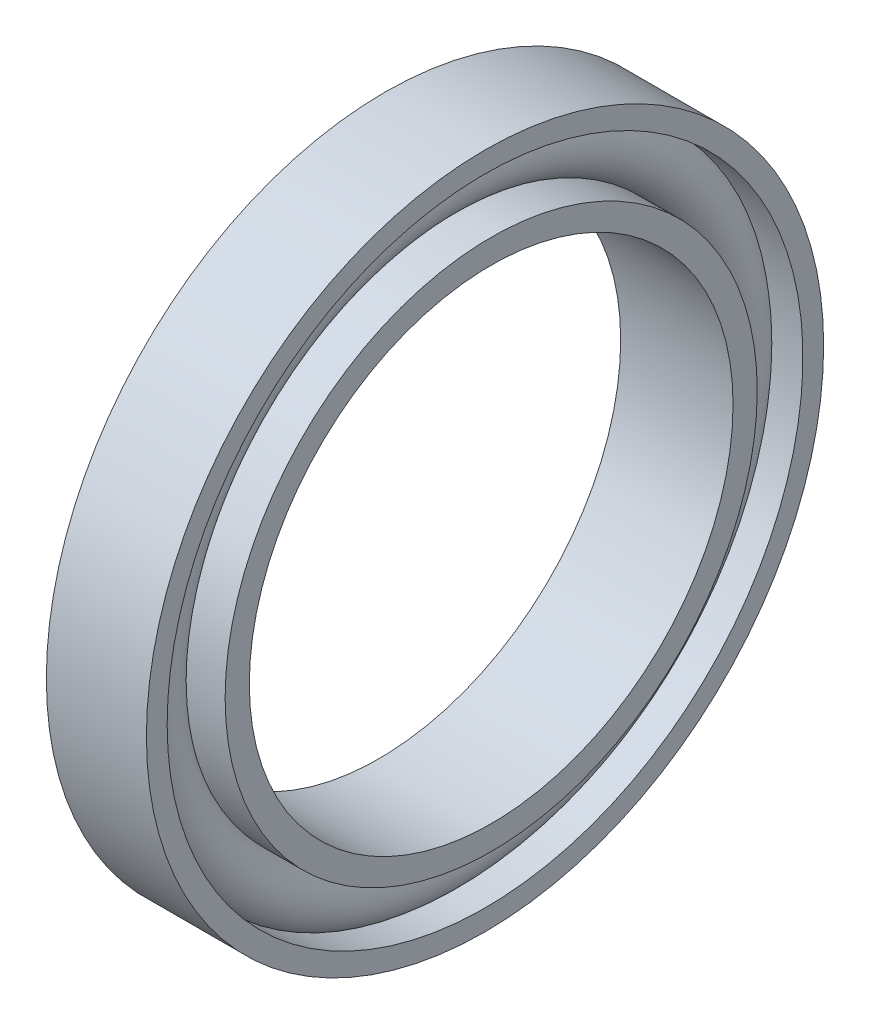
ISO-10303-21;
HEADER;
FILE_DESCRIPTION(('STEP AP214'),'2;1');
FILE_NAME('part.step','',(''),(''),'','','');
FILE_SCHEMA(('AUTOMOTIVE_DESIGN { 1 0 10303 214 1 1 1 1 }'));
ENDSEC;
DATA;
#1=APPLICATION_CONTEXT('core data for automotive mechanical design processes');
#2=APPLICATION_PROTOCOL_DEFINITION('international standard','automotive_design',2000,#1);
#3=PRODUCT_CONTEXT('',#1,'mechanical');
#4=PRODUCT('Part','Part','',(#3));
#5=PRODUCT_RELATED_PRODUCT_CATEGORY('part','',(#4));
#6=PRODUCT_DEFINITION_FORMATION('','',#4);
#7=PRODUCT_DEFINITION_CONTEXT('part definition',#1,'design');
#8=PRODUCT_DEFINITION('design','',#6,#7);
#9=PRODUCT_DEFINITION_SHAPE('','',#8);
#10=(LENGTH_UNIT() NAMED_UNIT(*) SI_UNIT(.MILLI.,.METRE.));
#11=(NAMED_UNIT(*) PLANE_ANGLE_UNIT() SI_UNIT($,.RADIAN.));
#12=(NAMED_UNIT(*) SI_UNIT($,.STERADIAN.) SOLID_ANGLE_UNIT());
#13=UNCERTAINTY_MEASURE_WITH_UNIT(LENGTH_MEASURE(1.E-05),#10,'distance_accuracy_value','');
#14=(GEOMETRIC_REPRESENTATION_CONTEXT(3) GLOBAL_UNCERTAINTY_ASSIGNED_CONTEXT((#13)) GLOBAL_UNIT_ASSIGNED_CONTEXT((#10,
#11,#12)) REPRESENTATION_CONTEXT('',''));
#15=CARTESIAN_POINT('',(0.,0.,0.));
#16=DIRECTION('',(0.,0.,1.));
#17=DIRECTION('',(1.,0.,0.));
#18=AXIS2_PLACEMENT_3D('',#15,#16,#17);
#19=CARTESIAN_POINT('',(0.,0.,0.));
#20=DIRECTION('',(-1.,0.,0.));
#21=DIRECTION('',(0.,0.,1.));
#22=AXIS2_PLACEMENT_3D('',#19,#20,#21);
#23=CYLINDRICAL_SURFACE('',#22,19.25);
#24=CARTESIAN_POINT('',(2.47183842600442,0.,0.));
#25=DIRECTION('',(-1.,0.,0.));
#26=DIRECTION('',(0.,0.,1.));
#27=AXIS2_PLACEMENT_3D('',#24,#25,#26);
#28=CIRCLE('',#27,19.25);
#29=CARTESIAN_POINT('',(2.47183842600442,0.,19.25));
#30=VERTEX_POINT('',#29);
#31=EDGE_CURVE('E29',#30,#30,#28,.F.);
#32=ORIENTED_EDGE('',*,*,#31,.F.);
#33=EDGE_LOOP('',(#32));
#34=FACE_BOUND('',#33,.T.);
#35=CARTESIAN_POINT('',(-0.445,0.,0.));
#36=DIRECTION('',(-1.,0.,0.));
#37=DIRECTION('',(0.,0.,1.));
#38=AXIS2_PLACEMENT_3D('',#35,#36,#37);
#39=CIRCLE('',#38,19.25);
#40=CARTESIAN_POINT('',(-0.445,0.,19.25));
#41=VERTEX_POINT('',#40);
#42=EDGE_CURVE('E17',#41,#41,#39,.F.);
#43=ORIENTED_EDGE('',*,*,#42,.T.);
#44=EDGE_LOOP('',(#43));
#45=FACE_BOUND('',#44,.T.);
#46=ADVANCED_FACE('F14',(#34,#45),#23,.T.);
#47=CARTESIAN_POINT('',(-0.445,17.5,0.));
#48=DIRECTION('',(1.,0.,0.));
#49=DIRECTION('',(0.,0.,-1.));
#50=AXIS2_PLACEMENT_3D('',#47,#48,#49);
#51=PLANE('',#50);
#52=ORIENTED_EDGE('',*,*,#42,.F.);
#53=EDGE_LOOP('',(#52));
#54=FACE_BOUND('',#53,.T.);
#55=CARTESIAN_POINT('',(-0.445,0.,0.));
#56=DIRECTION('',(-1.,0.,0.));
#57=DIRECTION('',(0.,0.,1.));
#58=AXIS2_PLACEMENT_3D('',#55,#56,#57);
#59=CIRCLE('',#58,17.5);
#60=CARTESIAN_POINT('',(-0.445,0.,17.5));
#61=VERTEX_POINT('',#60);
#62=EDGE_CURVE('E51',#61,#61,#59,.F.);
#63=ORIENTED_EDGE('',*,*,#62,.T.);
#64=EDGE_LOOP('',(#63));
#65=FACE_BOUND('',#64,.T.);
#66=ADVANCED_FACE('F64',(#54,#65),#51,.F.);
#67=CARTESIAN_POINT('',(3.62,0.,0.));
#68=DIRECTION('',(-1.,0.,0.));
#69=DIRECTION('',(0.,0.,1.));
#70=AXIS2_PLACEMENT_3D('',#67,#68,#69);
#71=TOROIDAL_SURFACE('',#70,21.185,2.25);
#72=CARTESIAN_POINT('',(2.12893494441054,0.,0.));
#73=DIRECTION('',(1.,0.,0.));
#74=DIRECTION('',(0.,0.,-1.));
#75=AXIS2_PLACEMENT_3D('',#72,#73,#74);
#76=CIRCLE('',#75,19.5);
#77=CARTESIAN_POINT('',(2.12893494441054,0.,-19.5));
#78=VERTEX_POINT('',#77);
#79=EDGE_CURVE('E50',#78,#78,#76,.F.);
#80=ORIENTED_EDGE('',*,*,#79,.T.);
#81=EDGE_LOOP('',(#80));
#82=FACE_BOUND('',#81,.T.);
#83=ORIENTED_EDGE('',*,*,#31,.T.);
#84=EDGE_LOOP('',(#83));
#85=FACE_BOUND('',#84,.T.);
#86=ADVANCED_FACE('F66',(#82,#85),#71,.T.);
#87=CARTESIAN_POINT('',(0.,0.,0.));
#88=DIRECTION('',(-1.,0.,0.));
#89=DIRECTION('',(0.,0.,1.));
#90=AXIS2_PLACEMENT_3D('',#87,#88,#89);
#91=CYLINDRICAL_SURFACE('',#90,17.5);
#92=CARTESIAN_POINT('',(7.685,0.,0.));
#93=DIRECTION('',(-1.,0.,0.));
#94=DIRECTION('',(0.,0.,1.));
#95=AXIS2_PLACEMENT_3D('',#92,#93,#94);
#96=CIRCLE('',#95,17.5);
#97=CARTESIAN_POINT('',(7.685,0.,17.5));
#98=VERTEX_POINT('',#97);
#99=EDGE_CURVE('E48',#98,#98,#96,.F.);
#100=ORIENTED_EDGE('',*,*,#99,.T.);
#101=EDGE_LOOP('',(#100));
#102=FACE_BOUND('',#101,.T.);
#103=ORIENTED_EDGE('',*,*,#62,.F.);
#104=EDGE_LOOP('',(#103));
#105=FACE_BOUND('',#104,.T.);
#106=ADVANCED_FACE('F72',(#102,#105),#91,.F.);
#107=CARTESIAN_POINT('',(0.,0.,0.));
#108=DIRECTION('',(1.,0.,0.));
#109=DIRECTION('',(0.,0.,-1.));
#110=AXIS2_PLACEMENT_3D('',#107,#108,#109);
#111=CYLINDRICAL_SURFACE('',#110,19.5);
#112=ORIENTED_EDGE('',*,*,#79,.F.);
#113=EDGE_LOOP('',(#112));
#114=FACE_BOUND('',#113,.T.);
#115=CARTESIAN_POINT('',(0.169999999999998,0.,0.));
#116=DIRECTION('',(1.,0.,0.));
#117=DIRECTION('',(0.,0.,-1.));
#118=AXIS2_PLACEMENT_3D('',#115,#116,#117);
#119=CIRCLE('',#118,19.5);
#120=CARTESIAN_POINT('',(0.169999999999998,0.,-19.5));
#121=VERTEX_POINT('',#120);
#122=EDGE_CURVE('E45',#121,#121,#119,.T.);
#123=ORIENTED_EDGE('',*,*,#122,.F.);
#124=EDGE_LOOP('',(#123));
#125=FACE_BOUND('',#124,.T.);
#126=ADVANCED_FACE('F122',(#114,#125),#111,.F.);
#127=CARTESIAN_POINT('',(7.685,17.5,0.));
#128=DIRECTION('',(-1.,0.,0.));
#129=DIRECTION('',(0.,0.,1.));
#130=AXIS2_PLACEMENT_3D('',#127,#128,#129);
#131=PLANE('',#130);
#132=ORIENTED_EDGE('',*,*,#99,.F.);
#133=EDGE_LOOP('',(#132));
#134=FACE_BOUND('',#133,.T.);
#135=CARTESIAN_POINT('',(7.685,0.,0.));
#136=DIRECTION('',(-1.,0.,0.));
#137=DIRECTION('',(0.,0.,1.));
#138=AXIS2_PLACEMENT_3D('',#135,#136,#137);
#139=CIRCLE('',#138,19.25);
#140=CARTESIAN_POINT('',(7.685,0.,19.25));
#141=VERTEX_POINT('',#140);
#142=EDGE_CURVE('E42',#141,#141,#139,.T.);
#143=ORIENTED_EDGE('',*,*,#142,.F.);
#144=EDGE_LOOP('',(#143));
#145=FACE_BOUND('',#144,.T.);
#146=ADVANCED_FACE('F126',(#134,#145),#131,.F.);
#147=CARTESIAN_POINT('',(0.169999999999997,22.5,0.));
#148=DIRECTION('',(-1.,0.,0.));
#149=DIRECTION('',(0.,0.,1.));
#150=AXIS2_PLACEMENT_3D('',#147,#148,#149);
#151=PLANE('',#150);
#152=CARTESIAN_POINT('',(0.169999999999997,0.,0.));
#153=DIRECTION('',(1.,0.,0.));
#154=DIRECTION('',(0.,0.,-1.));
#155=AXIS2_PLACEMENT_3D('',#152,#153,#154);
#156=CIRCLE('',#155,22.5);
#157=CARTESIAN_POINT('',(0.169999999999997,0.,-22.5));
#158=VERTEX_POINT('',#157);
#159=EDGE_CURVE('E38',#158,#158,#156,.T.);
#160=ORIENTED_EDGE('',*,*,#159,.F.);
#161=EDGE_LOOP('',(#160));
#162=FACE_BOUND('',#161,.T.);
#163=ORIENTED_EDGE('',*,*,#122,.T.);
#164=EDGE_LOOP('',(#163));
#165=FACE_BOUND('',#164,.T.);
#166=ADVANCED_FACE('F130',(#162,#165),#151,.T.);
#167=CARTESIAN_POINT('',(0.,0.,0.));
#168=DIRECTION('',(-1.,0.,0.));
#169=DIRECTION('',(0.,0.,1.));
#170=AXIS2_PLACEMENT_3D('',#167,#168,#169);
#171=CYLINDRICAL_SURFACE('',#170,19.25);
#172=CARTESIAN_POINT('',(4.76816157399558,0.,0.));
#173=DIRECTION('',(-1.,0.,0.));
#174=DIRECTION('',(0.,0.,1.));
#175=AXIS2_PLACEMENT_3D('',#172,#173,#174);
#176=CIRCLE('',#175,19.25);
#177=CARTESIAN_POINT('',(4.76816157399558,0.,19.25));
#178=VERTEX_POINT('',#177);
#179=EDGE_CURVE('E41',#178,#178,#176,.T.);
#180=ORIENTED_EDGE('',*,*,#179,.F.);
#181=EDGE_LOOP('',(#180));
#182=FACE_BOUND('',#181,.T.);
#183=ORIENTED_EDGE('',*,*,#142,.T.);
#184=EDGE_LOOP('',(#183));
#185=FACE_BOUND('',#184,.T.);
#186=ADVANCED_FACE('F134',(#182,#185),#171,.T.);
#187=CARTESIAN_POINT('',(0.,0.,0.));
#188=DIRECTION('',(1.,0.,0.));
#189=DIRECTION('',(0.,0.,-1.));
#190=AXIS2_PLACEMENT_3D('',#187,#188,#189);
#191=CYLINDRICAL_SURFACE('',#190,22.5);
#192=CARTESIAN_POINT('',(1.7942741169606,0.,0.));
#193=DIRECTION('',(-1.,0.,0.));
#194=DIRECTION('',(0.,0.,1.));
#195=AXIS2_PLACEMENT_3D('',#192,#193,#194);
#196=CIRCLE('',#195,22.5);
#197=CARTESIAN_POINT('',(1.7942741169606,0.,22.5));
#198=VERTEX_POINT('',#197);
#199=EDGE_CURVE('E112',#198,#198,#196,.F.);
#200=ORIENTED_EDGE('',*,*,#199,.F.);
#201=EDGE_LOOP('',(#200));
#202=FACE_BOUND('',#201,.T.);
#203=ORIENTED_EDGE('',*,*,#159,.T.);
#204=EDGE_LOOP('',(#203));
#205=FACE_BOUND('',#204,.T.);
#206=ADVANCED_FACE('F137',(#202,#205),#191,.T.);
#207=CARTESIAN_POINT('',(3.62,0.,0.));
#208=DIRECTION('',(-1.,0.,0.));
#209=DIRECTION('',(0.,0.,1.));
#210=AXIS2_PLACEMENT_3D('',#207,#208,#209);
#211=TOROIDAL_SURFACE('',#210,21.185,2.25);
#212=CARTESIAN_POINT('',(4.94976501683568,0.,0.));
#213=DIRECTION('',(-1.,0.,0.));
#214=DIRECTION('',(0.,0.,1.));
#215=AXIS2_PLACEMENT_3D('',#212,#213,#214);
#216=CIRCLE('',#215,23.);
#217=CARTESIAN_POINT('',(4.94976501683568,0.,23.));
#218=VERTEX_POINT('',#217);
#219=EDGE_CURVE('E110',#218,#218,#216,.F.);
#220=ORIENTED_EDGE('',*,*,#219,.T.);
#221=EDGE_LOOP('',(#220));
#222=FACE_BOUND('',#221,.T.);
#223=ORIENTED_EDGE('',*,*,#179,.T.);
#224=EDGE_LOOP('',(#223));
#225=FACE_BOUND('',#224,.T.);
#226=ADVANCED_FACE('F103',(#222,#225),#211,.T.);
#227=CARTESIAN_POINT('',(3.62,0.,0.));
#228=DIRECTION('',(-1.,0.,0.));
#229=DIRECTION('',(0.,0.,1.));
#230=AXIS2_PLACEMENT_3D('',#227,#228,#229);
#231=TOROIDAL_SURFACE('',#230,21.185,2.25);
#232=ORIENTED_EDGE('',*,*,#199,.T.);
#233=EDGE_LOOP('',(#232));
#234=FACE_BOUND('',#233,.T.);
#235=CARTESIAN_POINT('',(2.29023498316432,0.,0.));
#236=DIRECTION('',(-1.,0.,0.));
#237=DIRECTION('',(0.,0.,1.));
#238=AXIS2_PLACEMENT_3D('',#235,#236,#237);
#239=CIRCLE('',#238,23.);
#240=CARTESIAN_POINT('',(2.29023498316432,0.,23.));
#241=VERTEX_POINT('',#240);
#242=EDGE_CURVE('E37',#241,#241,#239,.T.);
#243=ORIENTED_EDGE('',*,*,#242,.T.);
#244=EDGE_LOOP('',(#243));
#245=FACE_BOUND('',#244,.T.);
#246=ADVANCED_FACE('F98',(#234,#245),#231,.T.);
#247=CARTESIAN_POINT('',(0.,0.,0.));
#248=DIRECTION('',(-1.,0.,0.));
#249=DIRECTION('',(0.,0.,1.));
#250=AXIS2_PLACEMENT_3D('',#247,#248,#249);
#251=CYLINDRICAL_SURFACE('',#250,23.);
#252=CARTESIAN_POINT('',(7.24,0.,0.));
#253=DIRECTION('',(-1.,0.,0.));
#254=DIRECTION('',(0.,0.,1.));
#255=AXIS2_PLACEMENT_3D('',#252,#253,#254);
#256=CIRCLE('',#255,23.);
#257=CARTESIAN_POINT('',(7.24,0.,23.));
#258=VERTEX_POINT('',#257);
#259=EDGE_CURVE('E34',#258,#258,#256,.F.);
#260=ORIENTED_EDGE('',*,*,#259,.T.);
#261=EDGE_LOOP('',(#260));
#262=FACE_BOUND('',#261,.T.);
#263=ORIENTED_EDGE('',*,*,#219,.F.);
#264=EDGE_LOOP('',(#263));
#265=FACE_BOUND('',#264,.T.);
#266=ADVANCED_FACE('F94',(#262,#265),#251,.F.);
#267=CARTESIAN_POINT('',(0.,0.,0.));
#268=DIRECTION('',(-1.,0.,0.));
#269=DIRECTION('',(0.,0.,1.));
#270=AXIS2_PLACEMENT_3D('',#267,#268,#269);
#271=CYLINDRICAL_SURFACE('',#270,23.);
#272=ORIENTED_EDGE('',*,*,#242,.F.);
#273=EDGE_LOOP('',(#272));
#274=FACE_BOUND('',#273,.T.);
#275=CARTESIAN_POINT('',(0.,0.,0.));
#276=DIRECTION('',(-1.,0.,0.));
#277=DIRECTION('',(0.,0.,1.));
#278=AXIS2_PLACEMENT_3D('',#275,#276,#277);
#279=CIRCLE('',#278,23.);
#280=CARTESIAN_POINT('',(0.,0.,23.));
#281=VERTEX_POINT('',#280);
#282=EDGE_CURVE('E26',#281,#281,#279,.T.);
#283=ORIENTED_EDGE('',*,*,#282,.T.);
#284=EDGE_LOOP('',(#283));
#285=FACE_BOUND('',#284,.T.);
#286=ADVANCED_FACE('F90',(#274,#285),#271,.F.);
#287=CARTESIAN_POINT('',(7.24,24.5,0.));
#288=DIRECTION('',(-1.,0.,0.));
#289=DIRECTION('',(0.,0.,1.));
#290=AXIS2_PLACEMENT_3D('',#287,#288,#289);
#291=PLANE('',#290);
#292=ORIENTED_EDGE('',*,*,#259,.F.);
#293=EDGE_LOOP('',(#292));
#294=FACE_BOUND('',#293,.T.);
#295=CARTESIAN_POINT('',(7.24,0.,0.));
#296=DIRECTION('',(-1.,0.,0.));
#297=DIRECTION('',(0.,0.,1.));
#298=AXIS2_PLACEMENT_3D('',#295,#296,#297);
#299=CIRCLE('',#298,24.5);
#300=CARTESIAN_POINT('',(7.24,0.,24.5));
#301=VERTEX_POINT('',#300);
#302=EDGE_CURVE('E21',#301,#301,#299,.T.);
#303=ORIENTED_EDGE('',*,*,#302,.F.);
#304=EDGE_LOOP('',(#303));
#305=FACE_BOUND('',#304,.T.);
#306=ADVANCED_FACE('F83',(#294,#305),#291,.F.);
#307=CARTESIAN_POINT('',(0.,23.,0.));
#308=DIRECTION('',(1.,0.,0.));
#309=DIRECTION('',(0.,0.,-1.));
#310=AXIS2_PLACEMENT_3D('',#307,#308,#309);
#311=PLANE('',#310);
#312=CARTESIAN_POINT('',(0.,0.,0.));
#313=DIRECTION('',(-1.,0.,0.));
#314=DIRECTION('',(0.,0.,1.));
#315=AXIS2_PLACEMENT_3D('',#312,#313,#314);
#316=CIRCLE('',#315,24.5);
#317=CARTESIAN_POINT('',(0.,0.,24.5));
#318=VERTEX_POINT('',#317);
#319=EDGE_CURVE('E10',#318,#318,#316,.F.);
#320=ORIENTED_EDGE('',*,*,#319,.F.);
#321=EDGE_LOOP('',(#320));
#322=FACE_BOUND('',#321,.T.);
#323=ORIENTED_EDGE('',*,*,#282,.F.);
#324=EDGE_LOOP('',(#323));
#325=FACE_BOUND('',#324,.T.);
#326=ADVANCED_FACE('F78',(#322,#325),#311,.F.);
#327=CARTESIAN_POINT('',(0.,0.,0.));
#328=DIRECTION('',(-1.,0.,0.));
#329=DIRECTION('',(0.,0.,1.));
#330=AXIS2_PLACEMENT_3D('',#327,#328,#329);
#331=CYLINDRICAL_SURFACE('',#330,24.5);
#332=ORIENTED_EDGE('',*,*,#319,.T.);
#333=EDGE_LOOP('',(#332));
#334=FACE_BOUND('',#333,.T.);
#335=ORIENTED_EDGE('',*,*,#302,.T.);
#336=EDGE_LOOP('',(#335));
#337=FACE_BOUND('',#336,.T.);
#338=ADVANCED_FACE('F76',(#334,#337),#331,.T.);
#339=CLOSED_SHELL('',(#46,#66,#86,#106,#126,#146,#166,#186,#206,#226,#246,#266,#286,#306,#326,#338));
#340=MANIFOLD_SOLID_BREP('B1',#339);
#341=ADVANCED_BREP_SHAPE_REPRESENTATION('',(#18,#340),#14);
#342=SHAPE_DEFINITION_REPRESENTATION(#9,#341);
ENDSEC;
END-ISO-10303-21;
